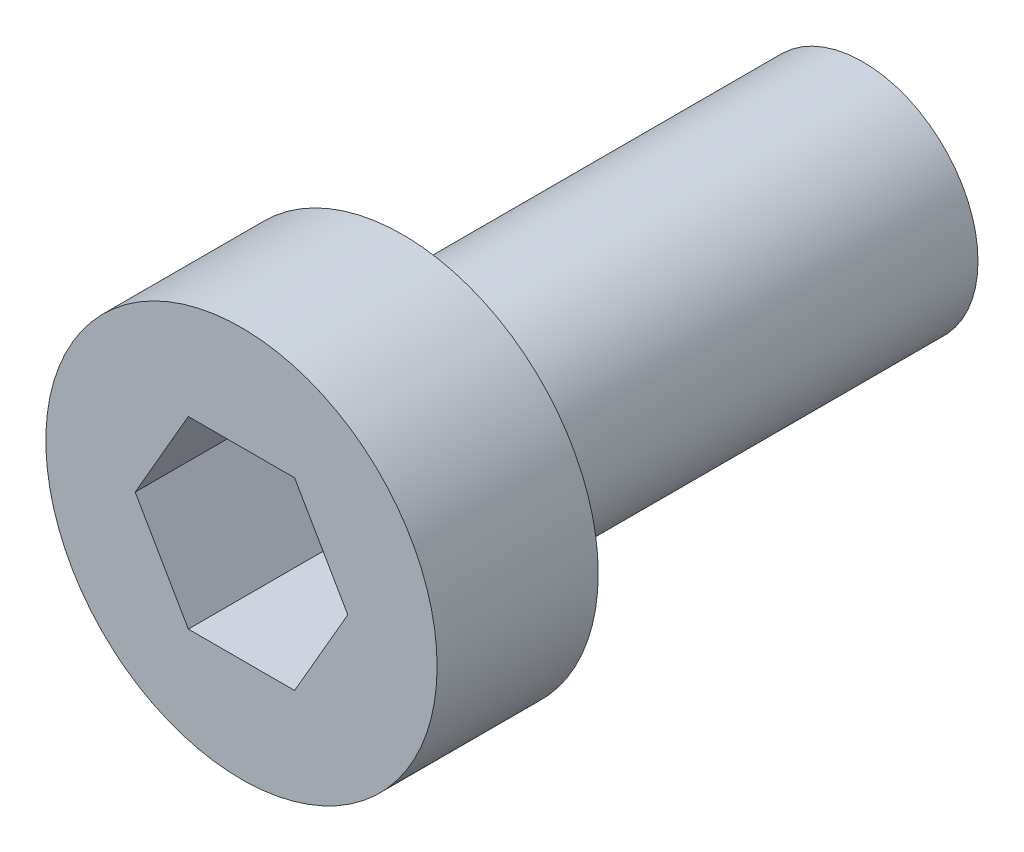
ISO-10303-21;
HEADER;
FILE_DESCRIPTION(('STEP AP214'),'2;1');
FILE_NAME('part.step','',(''),(''),'','','');
FILE_SCHEMA(('AUTOMOTIVE_DESIGN { 1 0 10303 214 1 1 1 1 }'));
ENDSEC;
DATA;
#1=APPLICATION_CONTEXT('core data for automotive mechanical design processes');
#2=APPLICATION_PROTOCOL_DEFINITION('international standard','automotive_design',2000,#1);
#3=PRODUCT_CONTEXT('',#1,'mechanical');
#4=PRODUCT('Part','Part','',(#3));
#5=PRODUCT_RELATED_PRODUCT_CATEGORY('part','',(#4));
#6=PRODUCT_DEFINITION_FORMATION('','',#4);
#7=PRODUCT_DEFINITION_CONTEXT('part definition',#1,'design');
#8=PRODUCT_DEFINITION('design','',#6,#7);
#9=PRODUCT_DEFINITION_SHAPE('','',#8);
#10=(LENGTH_UNIT() NAMED_UNIT(*) SI_UNIT(.MILLI.,.METRE.));
#11=(NAMED_UNIT(*) PLANE_ANGLE_UNIT() SI_UNIT($,.RADIAN.));
#12=(NAMED_UNIT(*) SI_UNIT($,.STERADIAN.) SOLID_ANGLE_UNIT());
#13=UNCERTAINTY_MEASURE_WITH_UNIT(LENGTH_MEASURE(1.E-05),#10,'distance_accuracy_value','');
#14=(GEOMETRIC_REPRESENTATION_CONTEXT(3) GLOBAL_UNCERTAINTY_ASSIGNED_CONTEXT((#13)) GLOBAL_UNIT_ASSIGNED_CONTEXT((#10,
#11,#12)) REPRESENTATION_CONTEXT('',''));
#15=CARTESIAN_POINT('',(0.,0.,0.));
#16=DIRECTION('',(0.,0.,1.));
#17=DIRECTION('',(1.,0.,0.));
#18=AXIS2_PLACEMENT_3D('',#15,#16,#17);
#19=CARTESIAN_POINT('',(0.,0.,10.));
#20=DIRECTION('',(0.,0.,-1.));
#21=DIRECTION('',(-1.,0.,0.));
#22=AXIS2_PLACEMENT_3D('',#19,#20,#21);
#23=CYLINDRICAL_SURFACE('',#22,2.5);
#24=CARTESIAN_POINT('',(0.,0.,10.));
#25=DIRECTION('',(0.,0.,1.));
#26=DIRECTION('',(1.,0.,0.));
#27=AXIS2_PLACEMENT_3D('',#24,#25,#26);
#28=CIRCLE('',#27,2.5);
#29=CARTESIAN_POINT('',(2.5,0.,10.));
#30=VERTEX_POINT('',#29);
#31=EDGE_CURVE('E11',#30,#30,#28,.T.);
#32=ORIENTED_EDGE('',*,*,#31,.F.);
#33=EDGE_LOOP('',(#32));
#34=FACE_BOUND('',#33,.T.);
#35=CARTESIAN_POINT('',(0.,0.,0.));
#36=DIRECTION('',(0.,0.,1.));
#37=DIRECTION('',(1.,0.,0.));
#38=AXIS2_PLACEMENT_3D('',#35,#36,#37);
#39=CIRCLE('',#38,2.5);
#40=CARTESIAN_POINT('',(2.5,0.,0.));
#41=VERTEX_POINT('',#40);
#42=EDGE_CURVE('E37',#41,#41,#39,.T.);
#43=ORIENTED_EDGE('',*,*,#42,.T.);
#44=EDGE_LOOP('',(#43));
#45=FACE_BOUND('',#44,.T.);
#46=ADVANCED_FACE('F34',(#34,#45),#23,.T.);
#47=CARTESIAN_POINT('',(0.,0.,0.));
#48=DIRECTION('',(0.,0.,1.));
#49=DIRECTION('',(1.,0.,0.));
#50=AXIS2_PLACEMENT_3D('',#47,#48,#49);
#51=PLANE('',#50);
#52=ORIENTED_EDGE('',*,*,#42,.F.);
#53=EDGE_LOOP('',(#52));
#54=FACE_BOUND('',#53,.T.);
#55=ADVANCED_FACE('F165',(#54),#51,.F.);
#56=CARTESIAN_POINT('',(0.,0.,13.5));
#57=DIRECTION('',(0.,0.,-1.));
#58=DIRECTION('',(-1.,0.,0.));
#59=AXIS2_PLACEMENT_3D('',#56,#57,#58);
#60=CYLINDRICAL_SURFACE('',#59,4.25);
#61=CARTESIAN_POINT('',(0.,0.,13.5));
#62=DIRECTION('',(0.,0.,1.));
#63=DIRECTION('',(1.,0.,0.));
#64=AXIS2_PLACEMENT_3D('',#61,#62,#63);
#65=CIRCLE('',#64,4.25);
#66=CARTESIAN_POINT('',(4.25,0.,13.5));
#67=VERTEX_POINT('',#66);
#68=EDGE_CURVE('E141',#67,#67,#65,.T.);
#69=ORIENTED_EDGE('',*,*,#68,.F.);
#70=EDGE_LOOP('',(#69));
#71=FACE_BOUND('',#70,.T.);
#72=CARTESIAN_POINT('',(0.,0.,10.));
#73=DIRECTION('',(0.,0.,1.));
#74=DIRECTION('',(1.,0.,0.));
#75=AXIS2_PLACEMENT_3D('',#72,#73,#74);
#76=CIRCLE('',#75,4.25);
#77=CARTESIAN_POINT('',(4.25,0.,10.));
#78=VERTEX_POINT('',#77);
#79=EDGE_CURVE('E135',#78,#78,#76,.T.);
#80=ORIENTED_EDGE('',*,*,#79,.T.);
#81=EDGE_LOOP('',(#80));
#82=FACE_BOUND('',#81,.T.);
#83=ADVANCED_FACE('F147',(#71,#82),#60,.T.);
#84=CARTESIAN_POINT('',(0.,0.,13.5));
#85=DIRECTION('',(0.,0.,1.));
#86=DIRECTION('',(1.,0.,0.));
#87=AXIS2_PLACEMENT_3D('',#84,#85,#86);
#88=PLANE('',#87);
#89=DIRECTION('',(0.5,0.866025403784439,0.));
#90=VECTOR('',#89,1.);
#91=CARTESIAN_POINT('',(1.15470053837925,-2.,13.5));
#92=LINE('',#91,#90);
#93=CARTESIAN_POINT('',(1.15470053837925,-2.,13.5));
#94=VERTEX_POINT('',#93);
#95=CARTESIAN_POINT('',(2.3094010767585,0.,13.5));
#96=VERTEX_POINT('',#95);
#97=EDGE_CURVE('E48',#94,#96,#92,.T.);
#98=ORIENTED_EDGE('',*,*,#97,.F.);
#99=DIRECTION('',(1.,0.,0.));
#100=VECTOR('',#99,1.);
#101=CARTESIAN_POINT('',(-1.15470053837925,-2.,13.5));
#102=LINE('',#101,#100);
#103=CARTESIAN_POINT('',(-1.15470053837925,-2.,13.5));
#104=VERTEX_POINT('',#103);
#105=EDGE_CURVE('E131',#104,#94,#102,.T.);
#106=ORIENTED_EDGE('',*,*,#105,.F.);
#107=DIRECTION('',(0.5,-0.866025403784439,0.));
#108=VECTOR('',#107,1.);
#109=CARTESIAN_POINT('',(-2.3094010767585,0.,13.5));
#110=LINE('',#109,#108);
#111=CARTESIAN_POINT('',(-2.3094010767585,0.,13.5));
#112=VERTEX_POINT('',#111);
#113=EDGE_CURVE('E129',#112,#104,#110,.T.);
#114=ORIENTED_EDGE('',*,*,#113,.F.);
#115=DIRECTION('',(-0.5,-0.866025403784439,0.));
#116=VECTOR('',#115,1.);
#117=CARTESIAN_POINT('',(-1.15470053837925,2.,13.5));
#118=LINE('',#117,#116);
#119=CARTESIAN_POINT('',(-1.15470053837925,2.,13.5));
#120=VERTEX_POINT('',#119);
#121=EDGE_CURVE('E96',#120,#112,#118,.T.);
#122=ORIENTED_EDGE('',*,*,#121,.F.);
#123=DIRECTION('',(-1.,0.,0.));
#124=VECTOR('',#123,1.);
#125=CARTESIAN_POINT('',(1.15470053837925,2.,13.5));
#126=LINE('',#125,#124);
#127=CARTESIAN_POINT('',(1.15470053837925,2.,13.5));
#128=VERTEX_POINT('',#127);
#129=EDGE_CURVE('E125',#128,#120,#126,.T.);
#130=ORIENTED_EDGE('',*,*,#129,.F.);
#131=DIRECTION('',(-0.5,0.866025403784438,0.));
#132=VECTOR('',#131,1.);
#133=CARTESIAN_POINT('',(2.3094010767585,0.,13.5));
#134=LINE('',#133,#132);
#135=EDGE_CURVE('E122',#96,#128,#134,.T.);
#136=ORIENTED_EDGE('',*,*,#135,.F.);
#137=EDGE_LOOP('',(#98,#106,#114,#122,#130,#136));
#138=FACE_BOUND('',#137,.T.);
#139=ORIENTED_EDGE('',*,*,#68,.T.);
#140=EDGE_LOOP('',(#139));
#141=FACE_BOUND('',#140,.T.);
#142=ADVANCED_FACE('F152',(#138,#141),#88,.T.);
#143=CARTESIAN_POINT('',(0.,0.,10.));
#144=DIRECTION('',(0.,0.,1.));
#145=DIRECTION('',(1.,0.,0.));
#146=AXIS2_PLACEMENT_3D('',#143,#144,#145);
#147=PLANE('',#146);
#148=ORIENTED_EDGE('',*,*,#31,.T.);
#149=EDGE_LOOP('',(#148));
#150=FACE_BOUND('',#149,.T.);
#151=ORIENTED_EDGE('',*,*,#79,.F.);
#152=EDGE_LOOP('',(#151));
#153=FACE_BOUND('',#152,.T.);
#154=ADVANCED_FACE('F149',(#150,#153),#147,.F.);
#155=CARTESIAN_POINT('',(1.15470053837925,-2.,10.));
#156=DIRECTION('',(0.866025403784439,-0.5,0.));
#157=DIRECTION('',(0.5,0.866025403784439,0.));
#158=AXIS2_PLACEMENT_3D('',#155,#156,#157);
#159=PLANE('',#158);
#160=ORIENTED_EDGE('',*,*,#97,.T.);
#161=DIRECTION('',(0.,0.,1.));
#162=VECTOR('',#161,1.);
#163=CARTESIAN_POINT('',(2.3094010767585,0.,10.));
#164=LINE('',#163,#162);
#165=CARTESIAN_POINT('',(2.3094010767585,0.,10.));
#166=VERTEX_POINT('',#165);
#167=EDGE_CURVE('E78',#166,#96,#164,.T.);
#168=ORIENTED_EDGE('',*,*,#167,.F.);
#169=DIRECTION('',(0.5,0.866025403784439,0.));
#170=VECTOR('',#169,1.);
#171=CARTESIAN_POINT('',(1.15470053837925,-2.,10.));
#172=LINE('',#171,#170);
#173=CARTESIAN_POINT('',(1.15470053837925,-2.,10.));
#174=VERTEX_POINT('',#173);
#175=EDGE_CURVE('E133',#174,#166,#172,.T.);
#176=ORIENTED_EDGE('',*,*,#175,.F.);
#177=DIRECTION('',(0.,0.,1.));
#178=VECTOR('',#177,1.);
#179=CARTESIAN_POINT('',(1.15470053837925,-2.,10.));
#180=LINE('',#179,#178);
#181=EDGE_CURVE('E56',#174,#94,#180,.T.);
#182=ORIENTED_EDGE('',*,*,#181,.T.);
#183=EDGE_LOOP('',(#160,#168,#176,#182));
#184=FACE_BOUND('',#183,.T.);
#185=ADVANCED_FACE('F151',(#184),#159,.F.);
#186=CARTESIAN_POINT('',(-1.15470053837925,-2.,10.));
#187=DIRECTION('',(0.,-1.,0.));
#188=DIRECTION('',(1.,0.,0.));
#189=AXIS2_PLACEMENT_3D('',#186,#187,#188);
#190=PLANE('',#189);
#191=ORIENTED_EDGE('',*,*,#105,.T.);
#192=ORIENTED_EDGE('',*,*,#181,.F.);
#193=DIRECTION('',(1.,0.,0.));
#194=VECTOR('',#193,1.);
#195=CARTESIAN_POINT('',(-1.15470053837925,-2.,10.));
#196=LINE('',#195,#194);
#197=CARTESIAN_POINT('',(-1.15470053837925,-2.,10.));
#198=VERTEX_POINT('',#197);
#199=EDGE_CURVE('E108',#198,#174,#196,.T.);
#200=ORIENTED_EDGE('',*,*,#199,.F.);
#201=DIRECTION('',(0.,0.,1.));
#202=VECTOR('',#201,1.);
#203=CARTESIAN_POINT('',(-1.15470053837925,-2.,10.));
#204=LINE('',#203,#202);
#205=EDGE_CURVE('E100',#198,#104,#204,.T.);
#206=ORIENTED_EDGE('',*,*,#205,.T.);
#207=EDGE_LOOP('',(#191,#192,#200,#206));
#208=FACE_BOUND('',#207,.T.);
#209=ADVANCED_FACE('F159',(#208),#190,.F.);
#210=CARTESIAN_POINT('',(-2.3094010767585,0.,10.));
#211=DIRECTION('',(-0.866025403784439,-0.5,0.));
#212=DIRECTION('',(0.5,-0.866025403784439,0.));
#213=AXIS2_PLACEMENT_3D('',#210,#211,#212);
#214=PLANE('',#213);
#215=ORIENTED_EDGE('',*,*,#113,.T.);
#216=ORIENTED_EDGE('',*,*,#205,.F.);
#217=DIRECTION('',(0.5,-0.866025403784439,0.));
#218=VECTOR('',#217,1.);
#219=CARTESIAN_POINT('',(-2.3094010767585,0.,10.));
#220=LINE('',#219,#218);
#221=CARTESIAN_POINT('',(-2.3094010767585,0.,10.));
#222=VERTEX_POINT('',#221);
#223=EDGE_CURVE('E104',#222,#198,#220,.T.);
#224=ORIENTED_EDGE('',*,*,#223,.F.);
#225=DIRECTION('',(0.,0.,1.));
#226=VECTOR('',#225,1.);
#227=CARTESIAN_POINT('',(-2.3094010767585,0.,10.));
#228=LINE('',#227,#226);
#229=EDGE_CURVE('E89',#222,#112,#228,.T.);
#230=ORIENTED_EDGE('',*,*,#229,.T.);
#231=EDGE_LOOP('',(#215,#216,#224,#230));
#232=FACE_BOUND('',#231,.T.);
#233=ADVANCED_FACE('F105',(#232),#214,.F.);
#234=CARTESIAN_POINT('',(-1.15470053837925,2.,10.));
#235=DIRECTION('',(-0.866025403784439,0.5,0.));
#236=DIRECTION('',(-0.5,-0.866025403784439,0.));
#237=AXIS2_PLACEMENT_3D('',#234,#235,#236);
#238=PLANE('',#237);
#239=ORIENTED_EDGE('',*,*,#121,.T.);
#240=ORIENTED_EDGE('',*,*,#229,.F.);
#241=DIRECTION('',(-0.5,-0.866025403784439,0.));
#242=VECTOR('',#241,1.);
#243=CARTESIAN_POINT('',(-1.15470053837925,2.,10.));
#244=LINE('',#243,#242);
#245=CARTESIAN_POINT('',(-1.15470053837925,2.,10.));
#246=VERTEX_POINT('',#245);
#247=EDGE_CURVE('E93',#246,#222,#244,.T.);
#248=ORIENTED_EDGE('',*,*,#247,.F.);
#249=DIRECTION('',(0.,0.,1.));
#250=VECTOR('',#249,1.);
#251=CARTESIAN_POINT('',(-1.15470053837925,2.,10.));
#252=LINE('',#251,#250);
#253=EDGE_CURVE('E101',#246,#120,#252,.T.);
#254=ORIENTED_EDGE('',*,*,#253,.T.);
#255=EDGE_LOOP('',(#239,#240,#248,#254));
#256=FACE_BOUND('',#255,.T.);
#257=ADVANCED_FACE('F91',(#256),#238,.F.);
#258=CARTESIAN_POINT('',(1.15470053837925,2.,10.));
#259=DIRECTION('',(0.,1.,0.));
#260=DIRECTION('',(0.,0.,1.));
#261=AXIS2_PLACEMENT_3D('',#258,#259,#260);
#262=PLANE('',#261);
#263=ORIENTED_EDGE('',*,*,#129,.T.);
#264=ORIENTED_EDGE('',*,*,#253,.F.);
#265=DIRECTION('',(-1.,0.,0.));
#266=VECTOR('',#265,1.);
#267=CARTESIAN_POINT('',(1.15470053837925,2.,10.));
#268=LINE('',#267,#266);
#269=CARTESIAN_POINT('',(1.15470053837925,2.,10.));
#270=VERTEX_POINT('',#269);
#271=EDGE_CURVE('E114',#270,#246,#268,.T.);
#272=ORIENTED_EDGE('',*,*,#271,.F.);
#273=DIRECTION('',(0.,0.,1.));
#274=VECTOR('',#273,1.);
#275=CARTESIAN_POINT('',(1.15470053837925,2.,10.));
#276=LINE('',#275,#274);
#277=EDGE_CURVE('E138',#270,#128,#276,.T.);
#278=ORIENTED_EDGE('',*,*,#277,.T.);
#279=EDGE_LOOP('',(#263,#264,#272,#278));
#280=FACE_BOUND('',#279,.T.);
#281=ADVANCED_FACE('F220',(#280),#262,.F.);
#282=CARTESIAN_POINT('',(2.3094010767585,0.,10.));
#283=DIRECTION('',(0.866025403784438,0.5,0.));
#284=DIRECTION('',(-0.5,0.866025403784439,0.));
#285=AXIS2_PLACEMENT_3D('',#282,#283,#284);
#286=PLANE('',#285);
#287=ORIENTED_EDGE('',*,*,#135,.T.);
#288=ORIENTED_EDGE('',*,*,#277,.F.);
#289=DIRECTION('',(-0.5,0.866025403784438,0.));
#290=VECTOR('',#289,1.);
#291=CARTESIAN_POINT('',(2.3094010767585,0.,10.));
#292=LINE('',#291,#290);
#293=EDGE_CURVE('E116',#166,#270,#292,.T.);
#294=ORIENTED_EDGE('',*,*,#293,.F.);
#295=ORIENTED_EDGE('',*,*,#167,.T.);
#296=EDGE_LOOP('',(#287,#288,#294,#295));
#297=FACE_BOUND('',#296,.T.);
#298=ADVANCED_FACE('F229',(#297),#286,.F.);
#299=CARTESIAN_POINT('',(0.,0.,10.));
#300=DIRECTION('',(0.,0.,1.));
#301=DIRECTION('',(1.,0.,0.));
#302=AXIS2_PLACEMENT_3D('',#299,#300,#301);
#303=PLANE('',#302);
#304=ORIENTED_EDGE('',*,*,#175,.T.);
#305=ORIENTED_EDGE('',*,*,#293,.T.);
#306=ORIENTED_EDGE('',*,*,#271,.T.);
#307=ORIENTED_EDGE('',*,*,#247,.T.);
#308=ORIENTED_EDGE('',*,*,#223,.T.);
#309=ORIENTED_EDGE('',*,*,#199,.T.);
#310=EDGE_LOOP('',(#304,#305,#306,#307,#308,#309));
#311=FACE_BOUND('',#310,.T.);
#312=ADVANCED_FACE('F111',(#311),#303,.T.);
#313=CLOSED_SHELL('',(#46,#55,#83,#142,#154,#185,#209,#233,#257,#281,#298,#312));
#314=MANIFOLD_SOLID_BREP('B2',#313);
#315=ADVANCED_BREP_SHAPE_REPRESENTATION('',(#18,#314),#14);
#316=SHAPE_DEFINITION_REPRESENTATION(#9,#315);
ENDSEC;
END-ISO-10303-21;
